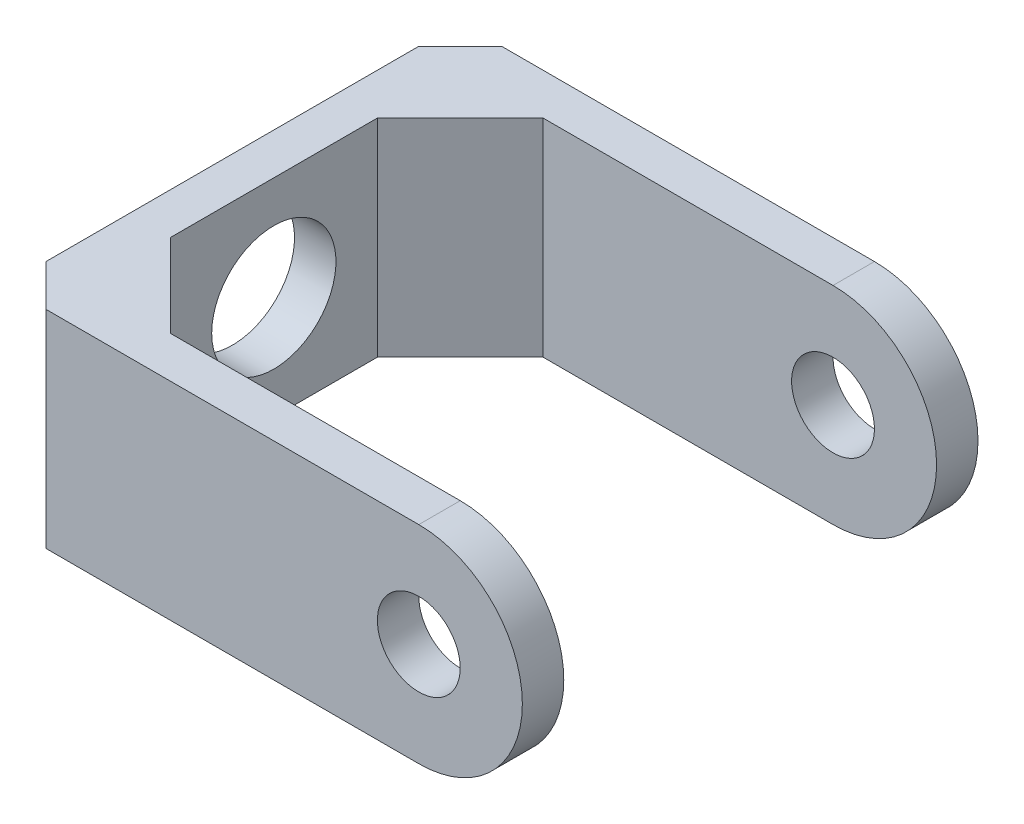
ISO-10303-21;
HEADER;
FILE_DESCRIPTION(('STEP AP214'),'2;1');
FILE_NAME('part.step','',(''),(''),'','','');
FILE_SCHEMA(('AUTOMOTIVE_DESIGN { 1 0 10303 214 1 1 1 1 }'));
ENDSEC;
DATA;
#1=APPLICATION_CONTEXT('core data for automotive mechanical design processes');
#2=APPLICATION_PROTOCOL_DEFINITION('international standard','automotive_design',2000,#1);
#3=PRODUCT_CONTEXT('',#1,'mechanical');
#4=PRODUCT('Part','Part','',(#3));
#5=PRODUCT_RELATED_PRODUCT_CATEGORY('part','',(#4));
#6=PRODUCT_DEFINITION_FORMATION('','',#4);
#7=PRODUCT_DEFINITION_CONTEXT('part definition',#1,'design');
#8=PRODUCT_DEFINITION('design','',#6,#7);
#9=PRODUCT_DEFINITION_SHAPE('','',#8);
#10=(LENGTH_UNIT() NAMED_UNIT(*) SI_UNIT(.MILLI.,.METRE.));
#11=(NAMED_UNIT(*) PLANE_ANGLE_UNIT() SI_UNIT($,.RADIAN.));
#12=(NAMED_UNIT(*) SI_UNIT($,.STERADIAN.) SOLID_ANGLE_UNIT());
#13=UNCERTAINTY_MEASURE_WITH_UNIT(LENGTH_MEASURE(1.E-05),#10,'distance_accuracy_value','');
#14=(GEOMETRIC_REPRESENTATION_CONTEXT(3) GLOBAL_UNCERTAINTY_ASSIGNED_CONTEXT((#13)) GLOBAL_UNIT_ASSIGNED_CONTEXT((#10,
#11,#12)) REPRESENTATION_CONTEXT('',''));
#15=CARTESIAN_POINT('',(0.,0.,0.));
#16=DIRECTION('',(0.,0.,1.));
#17=DIRECTION('',(1.,0.,0.));
#18=AXIS2_PLACEMENT_3D('',#15,#16,#17);
#19=CARTESIAN_POINT('',(18.,5.,2.));
#20=DIRECTION('',(0.,0.,1.));
#21=DIRECTION('',(1.,0.,0.));
#22=AXIS2_PLACEMENT_3D('',#19,#20,#21);
#23=PLANE('',#22);
#24=DIRECTION('',(-1.,0.,0.));
#25=VECTOR('',#24,1.);
#26=CARTESIAN_POINT('',(0.,10.,2.));
#27=LINE('',#26,#25);
#28=CARTESIAN_POINT('',(18.,10.,2.));
#29=VERTEX_POINT('',#28);
#30=CARTESIAN_POINT('',(4.00000000000002,10.,2.));
#31=VERTEX_POINT('',#30);
#32=EDGE_CURVE('E195',#29,#31,#27,.T.);
#33=ORIENTED_EDGE('',*,*,#32,.T.);
#34=DIRECTION('',(0.,-1.,0.));
#35=VECTOR('',#34,1.);
#36=CARTESIAN_POINT('',(4.00000000000002,5.,2.));
#37=LINE('',#36,#35);
#38=CARTESIAN_POINT('',(4.00000000000002,0.,2.));
#39=VERTEX_POINT('',#38);
#40=EDGE_CURVE('E233',#31,#39,#37,.T.);
#41=ORIENTED_EDGE('',*,*,#40,.T.);
#42=DIRECTION('',(1.,0.,0.));
#43=VECTOR('',#42,1.);
#44=CARTESIAN_POINT('',(0.,0.,2.));
#45=LINE('',#44,#43);
#46=CARTESIAN_POINT('',(18.,0.,2.));
#47=VERTEX_POINT('',#46);
#48=EDGE_CURVE('E190',#39,#47,#45,.T.);
#49=ORIENTED_EDGE('',*,*,#48,.T.);
#50=CARTESIAN_POINT('',(18.,5.,2.));
#51=DIRECTION('',(0.,0.,1.));
#52=DIRECTION('',(1.,0.,0.));
#53=AXIS2_PLACEMENT_3D('',#50,#51,#52);
#54=CIRCLE('',#53,5.);
#55=EDGE_CURVE('E192',#47,#29,#54,.T.);
#56=ORIENTED_EDGE('',*,*,#55,.T.);
#57=EDGE_LOOP('',(#33,#41,#49,#56));
#58=FACE_BOUND('',#57,.T.);
#59=CARTESIAN_POINT('',(18.,5.,2.));
#60=DIRECTION('',(0.,0.,1.));
#61=DIRECTION('',(1.,0.,0.));
#62=AXIS2_PLACEMENT_3D('',#59,#60,#61);
#63=CIRCLE('',#62,2.);
#64=CARTESIAN_POINT('',(20.,5.,2.));
#65=VERTEX_POINT('',#64);
#66=EDGE_CURVE('E184',#65,#65,#63,.T.);
#67=ORIENTED_EDGE('',*,*,#66,.F.);
#68=EDGE_LOOP('',(#67));
#69=FACE_BOUND('',#68,.T.);
#70=ADVANCED_FACE('F45',(#58,#69),#23,.T.);
#71=CARTESIAN_POINT('',(18.,5.,0.));
#72=DIRECTION('',(0.,0.,1.));
#73=DIRECTION('',(1.,0.,0.));
#74=AXIS2_PLACEMENT_3D('',#71,#72,#73);
#75=PLANE('',#74);
#76=DIRECTION('',(1.,0.,0.));
#77=VECTOR('',#76,1.);
#78=CARTESIAN_POINT('',(0.,0.,0.));
#79=LINE('',#78,#77);
#80=CARTESIAN_POINT('',(0.,0.,0.));
#81=VERTEX_POINT('',#80);
#82=CARTESIAN_POINT('',(18.,0.,0.));
#83=VERTEX_POINT('',#82);
#84=EDGE_CURVE('E187',#81,#83,#79,.T.);
#85=ORIENTED_EDGE('',*,*,#84,.F.);
#86=DIRECTION('',(0.,1.,0.));
#87=VECTOR('',#86,1.);
#88=CARTESIAN_POINT('',(0.,10.,0.));
#89=LINE('',#88,#87);
#90=CARTESIAN_POINT('',(0.,10.,0.));
#91=VERTEX_POINT('',#90);
#92=EDGE_CURVE('E224',#81,#91,#89,.T.);
#93=ORIENTED_EDGE('',*,*,#92,.T.);
#94=DIRECTION('',(-1.,0.,0.));
#95=VECTOR('',#94,1.);
#96=CARTESIAN_POINT('',(0.,10.,0.));
#97=LINE('',#96,#95);
#98=CARTESIAN_POINT('',(18.,10.,0.));
#99=VERTEX_POINT('',#98);
#100=EDGE_CURVE('E193',#99,#91,#97,.T.);
#101=ORIENTED_EDGE('',*,*,#100,.F.);
#102=CARTESIAN_POINT('',(18.,5.,0.));
#103=DIRECTION('',(0.,0.,1.));
#104=DIRECTION('',(1.,0.,0.));
#105=AXIS2_PLACEMENT_3D('',#102,#103,#104);
#106=CIRCLE('',#105,5.);
#107=EDGE_CURVE('E199',#83,#99,#106,.T.);
#108=ORIENTED_EDGE('',*,*,#107,.F.);
#109=EDGE_LOOP('',(#85,#93,#101,#108));
#110=FACE_BOUND('',#109,.T.);
#111=CARTESIAN_POINT('',(18.,5.,0.));
#112=DIRECTION('',(0.,0.,1.));
#113=DIRECTION('',(1.,0.,0.));
#114=AXIS2_PLACEMENT_3D('',#111,#112,#113);
#115=CIRCLE('',#114,2.);
#116=CARTESIAN_POINT('',(20.,5.,0.));
#117=VERTEX_POINT('',#116);
#118=EDGE_CURVE('E183',#117,#117,#115,.T.);
#119=ORIENTED_EDGE('',*,*,#118,.T.);
#120=EDGE_LOOP('',(#119));
#121=FACE_BOUND('',#120,.T.);
#122=ADVANCED_FACE('F257',(#110,#121),#75,.F.);
#123=CARTESIAN_POINT('',(0.,0.,2.));
#124=DIRECTION('',(0.,1.,0.));
#125=DIRECTION('',(0.,0.,1.));
#126=AXIS2_PLACEMENT_3D('',#123,#124,#125);
#127=PLANE('',#126);
#128=DIRECTION('',(1.,0.,0.));
#129=VECTOR('',#128,1.);
#130=CARTESIAN_POINT('',(-2.,0.,22.));
#131=LINE('',#130,#129);
#132=CARTESIAN_POINT('',(0.,0.,22.));
#133=VERTEX_POINT('',#132);
#134=CARTESIAN_POINT('',(18.,0.,22.));
#135=VERTEX_POINT('',#134);
#136=EDGE_CURVE('E181',#133,#135,#131,.T.);
#137=ORIENTED_EDGE('',*,*,#136,.F.);
#138=DIRECTION('',(-0.707106781186549,0.,-0.707106781186546));
#139=VECTOR('',#138,1.);
#140=CARTESIAN_POINT('',(-2.,0.,20.));
#141=LINE('',#140,#139);
#142=CARTESIAN_POINT('',(-2.,0.,20.));
#143=VERTEX_POINT('',#142);
#144=EDGE_CURVE('E222',#133,#143,#141,.T.);
#145=ORIENTED_EDGE('',*,*,#144,.T.);
#146=DIRECTION('',(0.,0.,1.));
#147=VECTOR('',#146,1.);
#148=CARTESIAN_POINT('',(-2.,0.,0.));
#149=LINE('',#148,#147);
#150=CARTESIAN_POINT('',(-2.,0.,1.99999999999999));
#151=VERTEX_POINT('',#150);
#152=EDGE_CURVE('E170',#151,#143,#149,.T.);
#153=ORIENTED_EDGE('',*,*,#152,.F.);
#154=DIRECTION('',(0.70710678118655,0.,-0.707106781186545));
#155=VECTOR('',#154,1.);
#156=CARTESIAN_POINT('',(-2.,0.,1.99999999999999));
#157=LINE('',#156,#155);
#158=EDGE_CURVE('E220',#151,#81,#157,.T.);
#159=ORIENTED_EDGE('',*,*,#158,.T.);
#160=ORIENTED_EDGE('',*,*,#84,.T.);
#161=DIRECTION('',(0.,0.,-1.));
#162=VECTOR('',#161,1.);
#163=CARTESIAN_POINT('',(18.,0.,2.));
#164=LINE('',#163,#162);
#165=EDGE_CURVE('E205',#47,#83,#164,.T.);
#166=ORIENTED_EDGE('',*,*,#165,.F.);
#167=ORIENTED_EDGE('',*,*,#48,.F.);
#168=DIRECTION('',(-0.707106781186551,0.,0.707106781186544));
#169=VECTOR('',#168,1.);
#170=CARTESIAN_POINT('',(1.99999999999999,0.,4.00000000000001));
#171=LINE('',#170,#169);
#172=CARTESIAN_POINT('',(0.,0.,5.99999999999998));
#173=VERTEX_POINT('',#172);
#174=EDGE_CURVE('E55',#39,#173,#171,.T.);
#175=ORIENTED_EDGE('',*,*,#174,.T.);
#176=DIRECTION('',(0.,0.,1.));
#177=VECTOR('',#176,1.);
#178=CARTESIAN_POINT('',(0.,0.,0.));
#179=LINE('',#178,#177);
#180=CARTESIAN_POINT('',(0.,0.,16.));
#181=VERTEX_POINT('',#180);
#182=EDGE_CURVE('E156',#173,#181,#179,.T.);
#183=ORIENTED_EDGE('',*,*,#182,.T.);
#184=DIRECTION('',(0.707106781186544,0.,0.707106781186552));
#185=VECTOR('',#184,1.);
#186=CARTESIAN_POINT('',(-6.99999999999998,0.,8.99999999999991));
#187=LINE('',#186,#185);
#188=CARTESIAN_POINT('',(3.99999999999998,0.,20.));
#189=VERTEX_POINT('',#188);
#190=EDGE_CURVE('E143',#181,#189,#187,.T.);
#191=ORIENTED_EDGE('',*,*,#190,.T.);
#192=DIRECTION('',(1.,0.,0.));
#193=VECTOR('',#192,1.);
#194=CARTESIAN_POINT('',(0.,0.,20.));
#195=LINE('',#194,#193);
#196=CARTESIAN_POINT('',(18.,0.,20.));
#197=VERTEX_POINT('',#196);
#198=EDGE_CURVE('E136',#189,#197,#195,.T.);
#199=ORIENTED_EDGE('',*,*,#198,.T.);
#200=DIRECTION('',(0.,0.,1.));
#201=VECTOR('',#200,1.);
#202=CARTESIAN_POINT('',(18.,0.,20.));
#203=LINE('',#202,#201);
#204=EDGE_CURVE('E140',#197,#135,#203,.T.);
#205=ORIENTED_EDGE('',*,*,#204,.T.);
#206=EDGE_LOOP('',(#137,#145,#153,#159,#160,#166,#167,#175,#183,#191,#199,#205));
#207=FACE_BOUND('',#206,.T.);
#208=ADVANCED_FACE('F139',(#207),#127,.F.);
#209=CARTESIAN_POINT('',(18.,5.,2.));
#210=DIRECTION('',(0.,0.,-1.));
#211=DIRECTION('',(-1.,0.,0.));
#212=AXIS2_PLACEMENT_3D('',#209,#210,#211);
#213=CYLINDRICAL_SURFACE('',#212,5.);
#214=ORIENTED_EDGE('',*,*,#107,.T.);
#215=DIRECTION('',(0.,0.,-1.));
#216=VECTOR('',#215,1.);
#217=CARTESIAN_POINT('',(18.,10.,2.));
#218=LINE('',#217,#216);
#219=EDGE_CURVE('E197',#29,#99,#218,.T.);
#220=ORIENTED_EDGE('',*,*,#219,.F.);
#221=ORIENTED_EDGE('',*,*,#55,.F.);
#222=ORIENTED_EDGE('',*,*,#165,.T.);
#223=EDGE_LOOP('',(#214,#220,#221,#222));
#224=FACE_BOUND('',#223,.T.);
#225=ADVANCED_FACE('F275',(#224),#213,.T.);
#226=CARTESIAN_POINT('',(0.,10.,2.));
#227=DIRECTION('',(0.,-1.,0.));
#228=DIRECTION('',(0.,0.,-1.));
#229=AXIS2_PLACEMENT_3D('',#226,#227,#228);
#230=PLANE('',#229);
#231=DIRECTION('',(0.,0.,-1.));
#232=VECTOR('',#231,1.);
#233=CARTESIAN_POINT('',(-2.,10.,0.));
#234=LINE('',#233,#232);
#235=CARTESIAN_POINT('',(-2.,10.,20.));
#236=VERTEX_POINT('',#235);
#237=CARTESIAN_POINT('',(-2.,10.,1.99999999999999));
#238=VERTEX_POINT('',#237);
#239=EDGE_CURVE('E173',#236,#238,#234,.T.);
#240=ORIENTED_EDGE('',*,*,#239,.F.);
#241=DIRECTION('',(0.707106781186549,0.,0.707106781186546));
#242=VECTOR('',#241,1.);
#243=CARTESIAN_POINT('',(-2.,10.,20.));
#244=LINE('',#243,#242);
#245=CARTESIAN_POINT('',(0.,10.,22.));
#246=VERTEX_POINT('',#245);
#247=EDGE_CURVE('E216',#236,#246,#244,.T.);
#248=ORIENTED_EDGE('',*,*,#247,.T.);
#249=DIRECTION('',(1.,0.,0.));
#250=VECTOR('',#249,1.);
#251=CARTESIAN_POINT('',(-2.,10.,22.));
#252=LINE('',#251,#250);
#253=CARTESIAN_POINT('',(18.,10.,22.));
#254=VERTEX_POINT('',#253);
#255=EDGE_CURVE('E177',#246,#254,#252,.T.);
#256=ORIENTED_EDGE('',*,*,#255,.T.);
#257=DIRECTION('',(0.,0.,1.));
#258=VECTOR('',#257,1.);
#259=CARTESIAN_POINT('',(18.,10.,20.));
#260=LINE('',#259,#258);
#261=CARTESIAN_POINT('',(18.,10.,20.));
#262=VERTEX_POINT('',#261);
#263=EDGE_CURVE('E157',#262,#254,#260,.T.);
#264=ORIENTED_EDGE('',*,*,#263,.F.);
#265=DIRECTION('',(-1.,0.,0.));
#266=VECTOR('',#265,1.);
#267=CARTESIAN_POINT('',(0.,10.,20.));
#268=LINE('',#267,#266);
#269=CARTESIAN_POINT('',(3.99999999999998,10.,20.));
#270=VERTEX_POINT('',#269);
#271=EDGE_CURVE('E162',#262,#270,#268,.T.);
#272=ORIENTED_EDGE('',*,*,#271,.T.);
#273=DIRECTION('',(-0.707106781186544,0.,-0.707106781186552));
#274=VECTOR('',#273,1.);
#275=CARTESIAN_POINT('',(-6.99999999999998,10.,8.99999999999991));
#276=LINE('',#275,#274);
#277=CARTESIAN_POINT('',(0.,10.,16.));
#278=VERTEX_POINT('',#277);
#279=EDGE_CURVE('E236',#270,#278,#276,.T.);
#280=ORIENTED_EDGE('',*,*,#279,.T.);
#281=DIRECTION('',(0.,0.,-1.));
#282=VECTOR('',#281,1.);
#283=CARTESIAN_POINT('',(0.,10.,0.));
#284=LINE('',#283,#282);
#285=CARTESIAN_POINT('',(0.,10.,5.99999999999998));
#286=VERTEX_POINT('',#285);
#287=EDGE_CURVE('E174',#278,#286,#284,.T.);
#288=ORIENTED_EDGE('',*,*,#287,.T.);
#289=DIRECTION('',(0.707106781186551,0.,-0.707106781186544));
#290=VECTOR('',#289,1.);
#291=CARTESIAN_POINT('',(1.99999999999999,10.,4.00000000000001));
#292=LINE('',#291,#290);
#293=EDGE_CURVE('E11',#286,#31,#292,.T.);
#294=ORIENTED_EDGE('',*,*,#293,.T.);
#295=ORIENTED_EDGE('',*,*,#32,.F.);
#296=ORIENTED_EDGE('',*,*,#219,.T.);
#297=ORIENTED_EDGE('',*,*,#100,.T.);
#298=DIRECTION('',(-0.70710678118655,0.,0.707106781186545));
#299=VECTOR('',#298,1.);
#300=CARTESIAN_POINT('',(-2.,10.,1.99999999999999));
#301=LINE('',#300,#299);
#302=EDGE_CURVE('E214',#91,#238,#301,.T.);
#303=ORIENTED_EDGE('',*,*,#302,.T.);
#304=EDGE_LOOP('',(#240,#248,#256,#264,#272,#280,#288,#294,#295,#296,#297,#303));
#305=FACE_BOUND('',#304,.T.);
#306=ADVANCED_FACE('F250',(#305),#230,.F.);
#307=CARTESIAN_POINT('',(18.,5.,2.));
#308=DIRECTION('',(0.,0.,-1.));
#309=DIRECTION('',(-1.,0.,0.));
#310=AXIS2_PLACEMENT_3D('',#307,#308,#309);
#311=CYLINDRICAL_SURFACE('',#310,2.);
#312=ORIENTED_EDGE('',*,*,#66,.T.);
#313=EDGE_LOOP('',(#312));
#314=FACE_BOUND('',#313,.T.);
#315=ORIENTED_EDGE('',*,*,#118,.F.);
#316=EDGE_LOOP('',(#315));
#317=FACE_BOUND('',#316,.T.);
#318=ADVANCED_FACE('F282',(#314,#317),#311,.F.);
#319=CARTESIAN_POINT('',(-2.,10.,22.));
#320=DIRECTION('',(0.,0.,-1.));
#321=DIRECTION('',(-1.,0.,0.));
#322=AXIS2_PLACEMENT_3D('',#319,#320,#321);
#323=PLANE('',#322);
#324=ORIENTED_EDGE('',*,*,#255,.F.);
#325=DIRECTION('',(0.,-1.,0.));
#326=VECTOR('',#325,1.);
#327=CARTESIAN_POINT('',(0.,0.,22.));
#328=LINE('',#327,#326);
#329=EDGE_CURVE('E218',#246,#133,#328,.T.);
#330=ORIENTED_EDGE('',*,*,#329,.T.);
#331=ORIENTED_EDGE('',*,*,#136,.T.);
#332=CARTESIAN_POINT('',(18.,5.,22.));
#333=DIRECTION('',(0.,0.,1.));
#334=DIRECTION('',(1.,0.,0.));
#335=AXIS2_PLACEMENT_3D('',#332,#333,#334);
#336=CIRCLE('',#335,5.);
#337=EDGE_CURVE('E148',#135,#254,#336,.T.);
#338=ORIENTED_EDGE('',*,*,#337,.T.);
#339=EDGE_LOOP('',(#324,#330,#331,#338));
#340=FACE_BOUND('',#339,.T.);
#341=CARTESIAN_POINT('',(18.,5.,22.));
#342=DIRECTION('',(0.,0.,1.));
#343=DIRECTION('',(1.,0.,0.));
#344=AXIS2_PLACEMENT_3D('',#341,#342,#343);
#345=CIRCLE('',#344,2.);
#346=CARTESIAN_POINT('',(20.,5.,22.));
#347=VERTEX_POINT('',#346);
#348=EDGE_CURVE('E325',#347,#347,#345,.T.);
#349=ORIENTED_EDGE('',*,*,#348,.F.);
#350=EDGE_LOOP('',(#349));
#351=FACE_BOUND('',#350,.T.);
#352=ADVANCED_FACE('F273',(#340,#351),#323,.F.);
#353=CARTESIAN_POINT('',(-2.,0.,0.));
#354=DIRECTION('',(-1.,0.,0.));
#355=DIRECTION('',(0.,0.,1.));
#356=AXIS2_PLACEMENT_3D('',#353,#354,#355);
#357=PLANE('',#356);
#358=CARTESIAN_POINT('',(-2.,5.,11.));
#359=DIRECTION('',(-1.,0.,0.));
#360=DIRECTION('',(0.,0.,1.));
#361=AXIS2_PLACEMENT_3D('',#358,#359,#360);
#362=CIRCLE('',#361,3.);
#363=CARTESIAN_POINT('',(-2.,5.,14.));
#364=VERTEX_POINT('',#363);
#365=EDGE_CURVE('E322',#364,#364,#362,.T.);
#366=ORIENTED_EDGE('',*,*,#365,.F.);
#367=EDGE_LOOP('',(#366));
#368=FACE_BOUND('',#367,.T.);
#369=ORIENTED_EDGE('',*,*,#152,.T.);
#370=DIRECTION('',(0.,1.,0.));
#371=VECTOR('',#370,1.);
#372=CARTESIAN_POINT('',(-2.,10.,20.));
#373=LINE('',#372,#371);
#374=EDGE_CURVE('E211',#143,#236,#373,.T.);
#375=ORIENTED_EDGE('',*,*,#374,.T.);
#376=ORIENTED_EDGE('',*,*,#239,.T.);
#377=DIRECTION('',(0.,-1.,0.));
#378=VECTOR('',#377,1.);
#379=CARTESIAN_POINT('',(-2.,0.,1.99999999999999));
#380=LINE('',#379,#378);
#381=EDGE_CURVE('E208',#238,#151,#380,.T.);
#382=ORIENTED_EDGE('',*,*,#381,.T.);
#383=EDGE_LOOP('',(#369,#375,#376,#382));
#384=FACE_BOUND('',#383,.T.);
#385=ADVANCED_FACE('F264',(#368,#384),#357,.T.);
#386=CARTESIAN_POINT('',(0.,0.,0.));
#387=DIRECTION('',(-1.,0.,0.));
#388=DIRECTION('',(0.,0.,1.));
#389=AXIS2_PLACEMENT_3D('',#386,#387,#388);
#390=PLANE('',#389);
#391=CARTESIAN_POINT('',(0.,5.,11.));
#392=DIRECTION('',(-1.,0.,0.));
#393=DIRECTION('',(0.,0.,1.));
#394=AXIS2_PLACEMENT_3D('',#391,#392,#393);
#395=CIRCLE('',#394,3.);
#396=CARTESIAN_POINT('',(0.,5.,14.));
#397=VERTEX_POINT('',#396);
#398=EDGE_CURVE('E50',#397,#397,#395,.T.);
#399=ORIENTED_EDGE('',*,*,#398,.T.);
#400=EDGE_LOOP('',(#399));
#401=FACE_BOUND('',#400,.T.);
#402=ORIENTED_EDGE('',*,*,#287,.F.);
#403=DIRECTION('',(0.,-1.,0.));
#404=VECTOR('',#403,1.);
#405=CARTESIAN_POINT('',(0.,0.,16.));
#406=LINE('',#405,#404);
#407=EDGE_CURVE('E228',#278,#181,#406,.T.);
#408=ORIENTED_EDGE('',*,*,#407,.T.);
#409=ORIENTED_EDGE('',*,*,#182,.F.);
#410=DIRECTION('',(0.,1.,0.));
#411=VECTOR('',#410,1.);
#412=CARTESIAN_POINT('',(0.,0.,5.99999999999998));
#413=LINE('',#412,#411);
#414=EDGE_CURVE('E226',#173,#286,#413,.T.);
#415=ORIENTED_EDGE('',*,*,#414,.T.);
#416=EDGE_LOOP('',(#402,#408,#409,#415));
#417=FACE_BOUND('',#416,.T.);
#418=ADVANCED_FACE('F243',(#401,#417),#390,.F.);
#419=CARTESIAN_POINT('',(18.,5.,20.));
#420=DIRECTION('',(0.,0.,-1.));
#421=DIRECTION('',(1.,0.,0.));
#422=AXIS2_PLACEMENT_3D('',#419,#420,#421);
#423=PLANE('',#422);
#424=ORIENTED_EDGE('',*,*,#198,.F.);
#425=DIRECTION('',(0.,1.,0.));
#426=VECTOR('',#425,1.);
#427=CARTESIAN_POINT('',(3.99999999999998,5.,20.));
#428=LINE('',#427,#426);
#429=EDGE_CURVE('E231',#189,#270,#428,.T.);
#430=ORIENTED_EDGE('',*,*,#429,.T.);
#431=ORIENTED_EDGE('',*,*,#271,.F.);
#432=CARTESIAN_POINT('',(18.,5.,20.));
#433=DIRECTION('',(0.,0.,1.));
#434=DIRECTION('',(1.,0.,0.));
#435=AXIS2_PLACEMENT_3D('',#432,#433,#434);
#436=CIRCLE('',#435,5.);
#437=EDGE_CURVE('E147',#197,#262,#436,.T.);
#438=ORIENTED_EDGE('',*,*,#437,.F.);
#439=EDGE_LOOP('',(#424,#430,#431,#438));
#440=FACE_BOUND('',#439,.T.);
#441=CARTESIAN_POINT('',(18.,5.,20.));
#442=DIRECTION('',(0.,0.,1.));
#443=DIRECTION('',(1.,0.,0.));
#444=AXIS2_PLACEMENT_3D('',#441,#442,#443);
#445=CIRCLE('',#444,2.);
#446=CARTESIAN_POINT('',(20.,5.,20.));
#447=VERTEX_POINT('',#446);
#448=EDGE_CURVE('E168',#447,#447,#445,.T.);
#449=ORIENTED_EDGE('',*,*,#448,.T.);
#450=EDGE_LOOP('',(#449));
#451=FACE_BOUND('',#450,.T.);
#452=ADVANCED_FACE('F159',(#440,#451),#423,.T.);
#453=CARTESIAN_POINT('',(18.,5.,20.));
#454=DIRECTION('',(0.,0.,1.));
#455=DIRECTION('',(-1.,0.,0.));
#456=AXIS2_PLACEMENT_3D('',#453,#454,#455);
#457=CYLINDRICAL_SURFACE('',#456,5.);
#458=ORIENTED_EDGE('',*,*,#337,.F.);
#459=ORIENTED_EDGE('',*,*,#204,.F.);
#460=ORIENTED_EDGE('',*,*,#437,.T.);
#461=ORIENTED_EDGE('',*,*,#263,.T.);
#462=EDGE_LOOP('',(#458,#459,#460,#461));
#463=FACE_BOUND('',#462,.T.);
#464=ADVANCED_FACE('F152',(#463),#457,.T.);
#465=CARTESIAN_POINT('',(18.,5.,20.));
#466=DIRECTION('',(0.,0.,1.));
#467=DIRECTION('',(-1.,0.,0.));
#468=AXIS2_PLACEMENT_3D('',#465,#466,#467);
#469=CYLINDRICAL_SURFACE('',#468,2.);
#470=ORIENTED_EDGE('',*,*,#448,.F.);
#471=EDGE_LOOP('',(#470));
#472=FACE_BOUND('',#471,.T.);
#473=ORIENTED_EDGE('',*,*,#348,.T.);
#474=EDGE_LOOP('',(#473));
#475=FACE_BOUND('',#474,.T.);
#476=ADVANCED_FACE('F306',(#472,#475),#469,.F.);
#477=CARTESIAN_POINT('',(-2.,0.,20.));
#478=DIRECTION('',(-0.707106781186546,0.,0.707106781186549));
#479=DIRECTION('',(0.,-1.,0.));
#480=AXIS2_PLACEMENT_3D('',#477,#478,#479);
#481=PLANE('',#480);
#482=ORIENTED_EDGE('',*,*,#144,.F.);
#483=ORIENTED_EDGE('',*,*,#329,.F.);
#484=ORIENTED_EDGE('',*,*,#247,.F.);
#485=ORIENTED_EDGE('',*,*,#374,.F.);
#486=EDGE_LOOP('',(#482,#483,#484,#485));
#487=FACE_BOUND('',#486,.T.);
#488=ADVANCED_FACE('F269',(#487),#481,.T.);
#489=CARTESIAN_POINT('',(-2.,0.,1.99999999999999));
#490=DIRECTION('',(-0.707106781186545,0.,-0.70710678118655));
#491=DIRECTION('',(0.,1.,0.));
#492=AXIS2_PLACEMENT_3D('',#489,#490,#491);
#493=PLANE('',#492);
#494=ORIENTED_EDGE('',*,*,#302,.F.);
#495=ORIENTED_EDGE('',*,*,#92,.F.);
#496=ORIENTED_EDGE('',*,*,#158,.F.);
#497=ORIENTED_EDGE('',*,*,#381,.F.);
#498=EDGE_LOOP('',(#494,#495,#496,#497));
#499=FACE_BOUND('',#498,.T.);
#500=ADVANCED_FACE('F261',(#499),#493,.T.);
#501=CARTESIAN_POINT('',(0.,0.,16.));
#502=DIRECTION('',(-0.707106781186551,0.,0.707106781186543));
#503=DIRECTION('',(0.,-1.,0.));
#504=AXIS2_PLACEMENT_3D('',#501,#502,#503);
#505=PLANE('',#504);
#506=ORIENTED_EDGE('',*,*,#279,.F.);
#507=ORIENTED_EDGE('',*,*,#429,.F.);
#508=ORIENTED_EDGE('',*,*,#190,.F.);
#509=ORIENTED_EDGE('',*,*,#407,.F.);
#510=EDGE_LOOP('',(#506,#507,#508,#509));
#511=FACE_BOUND('',#510,.T.);
#512=ADVANCED_FACE('F318',(#511),#505,.F.);
#513=CARTESIAN_POINT('',(4.00000000000002,5.,2.));
#514=DIRECTION('',(-0.707106781186544,0.,-0.707106781186551));
#515=DIRECTION('',(0.,-1.,0.));
#516=AXIS2_PLACEMENT_3D('',#513,#514,#515);
#517=PLANE('',#516);
#518=ORIENTED_EDGE('',*,*,#293,.F.);
#519=ORIENTED_EDGE('',*,*,#414,.F.);
#520=ORIENTED_EDGE('',*,*,#174,.F.);
#521=ORIENTED_EDGE('',*,*,#40,.F.);
#522=EDGE_LOOP('',(#518,#519,#520,#521));
#523=FACE_BOUND('',#522,.T.);
#524=ADVANCED_FACE('F48',(#523),#517,.F.);
#525=CARTESIAN_POINT('',(23.,5.,11.));
#526=DIRECTION('',(-1.,0.,0.));
#527=DIRECTION('',(0.,0.,1.));
#528=AXIS2_PLACEMENT_3D('',#525,#526,#527);
#529=CYLINDRICAL_SURFACE('',#528,3.);
#530=ORIENTED_EDGE('',*,*,#365,.T.);
#531=EDGE_LOOP('',(#530));
#532=FACE_BOUND('',#531,.T.);
#533=ORIENTED_EDGE('',*,*,#398,.F.);
#534=EDGE_LOOP('',(#533));
#535=FACE_BOUND('',#534,.T.);
#536=ADVANCED_FACE('F312',(#532,#535),#529,.F.);
#537=CLOSED_SHELL('',(#70,#122,#208,#225,#306,#318,#352,#385,#418,#452,#464,#476,#488,#500,#512,
#524,#536));
#538=MANIFOLD_SOLID_BREP('B2',#537);
#539=ADVANCED_BREP_SHAPE_REPRESENTATION('',(#18,#538),#14);
#540=SHAPE_DEFINITION_REPRESENTATION(#9,#539);
ENDSEC;
END-ISO-10303-21;
